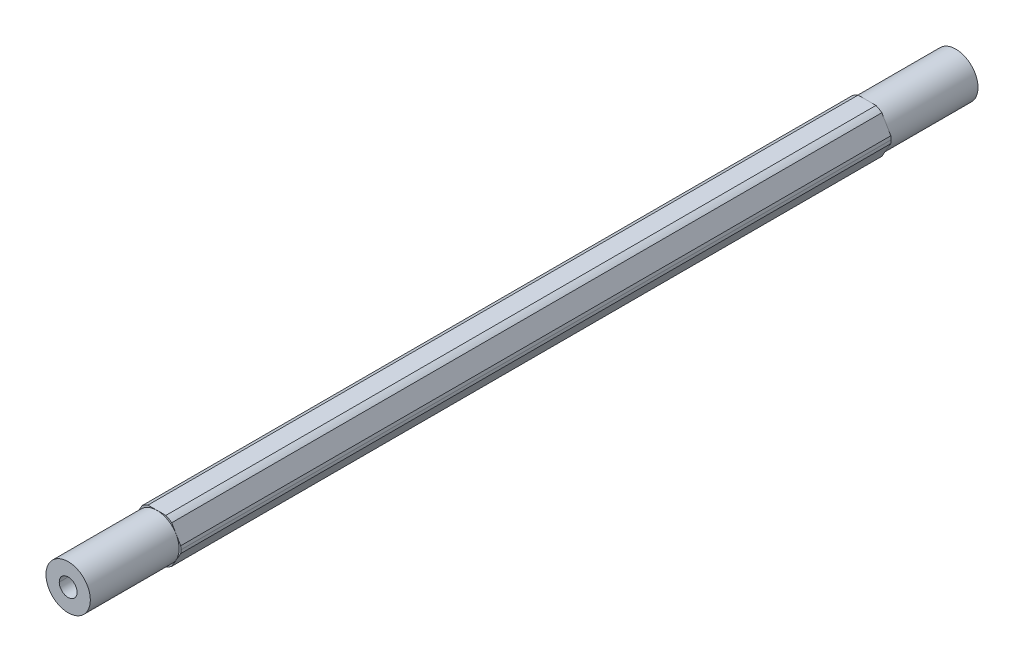
ISO-10303-21;
HEADER;
FILE_DESCRIPTION(('STEP AP214'),'2;1');
FILE_NAME('part.step','',(''),(''),'','','');
FILE_SCHEMA(('AUTOMOTIVE_DESIGN { 1 0 10303 214 1 1 1 1 }'));
ENDSEC;
DATA;
#1=APPLICATION_CONTEXT('core data for automotive mechanical design processes');
#2=APPLICATION_PROTOCOL_DEFINITION('international standard','automotive_design',2000,#1);
#3=PRODUCT_CONTEXT('',#1,'mechanical');
#4=PRODUCT('Part','Part','',(#3));
#5=PRODUCT_RELATED_PRODUCT_CATEGORY('part','',(#4));
#6=PRODUCT_DEFINITION_FORMATION('','',#4);
#7=PRODUCT_DEFINITION_CONTEXT('part definition',#1,'design');
#8=PRODUCT_DEFINITION('design','',#6,#7);
#9=PRODUCT_DEFINITION_SHAPE('','',#8);
#10=(LENGTH_UNIT() NAMED_UNIT(*) SI_UNIT(.MILLI.,.METRE.));
#11=(NAMED_UNIT(*) PLANE_ANGLE_UNIT() SI_UNIT($,.RADIAN.));
#12=(NAMED_UNIT(*) SI_UNIT($,.STERADIAN.) SOLID_ANGLE_UNIT());
#13=UNCERTAINTY_MEASURE_WITH_UNIT(LENGTH_MEASURE(1.E-05),#10,'distance_accuracy_value','');
#14=(GEOMETRIC_REPRESENTATION_CONTEXT(3) GLOBAL_UNCERTAINTY_ASSIGNED_CONTEXT((#13)) GLOBAL_UNIT_ASSIGNED_CONTEXT((#10,
#11,#12)) REPRESENTATION_CONTEXT('',''));
#15=CARTESIAN_POINT('',(0.,0.,0.));
#16=DIRECTION('',(0.,0.,1.));
#17=DIRECTION('',(1.,0.,0.));
#18=AXIS2_PLACEMENT_3D('',#15,#16,#17);
#19=CARTESIAN_POINT('',(0.,0.,-228.6));
#20=DIRECTION('',(0.,0.,1.));
#21=DIRECTION('',(1.,0.,0.));
#22=AXIS2_PLACEMENT_3D('',#19,#20,#21);
#23=CYLINDRICAL_SURFACE('',#22,6.87);
#24=DIRECTION('',(0.,0.,1.));
#25=VECTOR('',#24,1.);
#26=CARTESIAN_POINT('',(6.87,0.,-228.6));
#27=LINE('',#26,#25);
#28=CARTESIAN_POINT('',(6.87,0.,0.));
#29=VERTEX_POINT('',#28);
#30=CARTESIAN_POINT('',(6.87,0.,203.2));
#31=VERTEX_POINT('',#30);
#32=EDGE_CURVE('E165',#29,#31,#27,.T.);
#33=ORIENTED_EDGE('',*,*,#32,.T.);
#34=CARTESIAN_POINT('',(0.,0.,203.2));
#35=DIRECTION('',(0.,0.,1.));
#36=DIRECTION('',(1.,0.,0.));
#37=AXIS2_PLACEMENT_3D('',#34,#35,#36);
#38=CIRCLE('',#37,6.87);
#39=CARTESIAN_POINT('',(6.80102150534208,-0.971085209378942,203.2));
#40=VERTEX_POINT('',#39);
#41=EDGE_CURVE('E148',#40,#31,#38,.T.);
#42=ORIENTED_EDGE('',*,*,#41,.F.);
#43=DIRECTION('',(0.,0.,-1.));
#44=VECTOR('',#43,1.);
#45=CARTESIAN_POINT('',(6.80102150534208,-0.971085209378962,-228.6));
#46=LINE('',#45,#44);
#47=CARTESIAN_POINT('',(6.80102150534208,-0.971085209378955,0.));
#48=VERTEX_POINT('',#47);
#49=EDGE_CURVE('E174',#40,#48,#46,.T.);
#50=ORIENTED_EDGE('',*,*,#49,.T.);
#51=CARTESIAN_POINT('',(0.,0.,0.));
#52=DIRECTION('',(0.,0.,1.));
#53=DIRECTION('',(1.,0.,0.));
#54=AXIS2_PLACEMENT_3D('',#51,#52,#53);
#55=CIRCLE('',#54,6.87);
#56=EDGE_CURVE('E172',#48,#29,#55,.T.);
#57=ORIENTED_EDGE('',*,*,#56,.T.);
#58=EDGE_LOOP('',(#33,#42,#50,#57));
#59=FACE_BOUND('',#58,.T.);
#60=ADVANCED_FACE('F40',(#59),#23,.T.);
#61=CARTESIAN_POINT('',(3.68083890619154,-6.3754,228.6));
#62=DIRECTION('',(-0.866025403784439,0.5,0.));
#63=DIRECTION('',(0.,0.,1.));
#64=AXIS2_PLACEMENT_3D('',#61,#62,#63);
#65=PLANE('',#64);
#66=DIRECTION('',(0.5,0.866025403784439,0.));
#67=VECTOR('',#66,1.);
#68=CARTESIAN_POINT('',(3.68083890619154,-6.3754,203.2));
#69=LINE('',#68,#67);
#70=CARTESIAN_POINT('',(4.24149521323255,-5.40431479062105,203.2));
#71=VERTEX_POINT('',#70);
#72=EDGE_CURVE('E153',#71,#40,#69,.T.);
#73=ORIENTED_EDGE('',*,*,#72,.F.);
#74=DIRECTION('',(0.,0.,1.));
#75=VECTOR('',#74,1.);
#76=CARTESIAN_POINT('',(4.24149521323255,-5.40431479062104,-228.6));
#77=LINE('',#76,#75);
#78=CARTESIAN_POINT('',(4.24149521323255,-5.40431479062105,0.));
#79=VERTEX_POINT('',#78);
#80=EDGE_CURVE('E206',#79,#71,#77,.T.);
#81=ORIENTED_EDGE('',*,*,#80,.F.);
#82=DIRECTION('',(0.5,0.866025403784439,0.));
#83=VECTOR('',#82,1.);
#84=CARTESIAN_POINT('',(3.68083890619154,-6.3754,0.));
#85=LINE('',#84,#83);
#86=EDGE_CURVE('E262',#79,#48,#85,.T.);
#87=ORIENTED_EDGE('',*,*,#86,.T.);
#88=ORIENTED_EDGE('',*,*,#49,.F.);
#89=EDGE_LOOP('',(#73,#81,#87,#88));
#90=FACE_BOUND('',#89,.T.);
#91=ADVANCED_FACE('F298',(#90),#65,.F.);
#92=CARTESIAN_POINT('',(7.36167781238308,0.,228.6));
#93=DIRECTION('',(-0.866025403784439,-0.5,0.));
#94=DIRECTION('',(-0.5,0.866025403784439,0.));
#95=AXIS2_PLACEMENT_3D('',#92,#93,#94);
#96=PLANE('',#95);
#97=DIRECTION('',(-0.5,0.866025403784439,0.));
#98=VECTOR('',#97,1.);
#99=CARTESIAN_POINT('',(7.36167781238308,0.,203.2));
#100=LINE('',#99,#98);
#101=CARTESIAN_POINT('',(6.80102150534208,0.97108520937895,203.2));
#102=VERTEX_POINT('',#101);
#103=CARTESIAN_POINT('',(4.24149521323254,5.40431479062105,203.2));
#104=VERTEX_POINT('',#103);
#105=EDGE_CURVE('E55',#102,#104,#100,.T.);
#106=ORIENTED_EDGE('',*,*,#105,.F.);
#107=DIRECTION('',(0.,0.,1.));
#108=VECTOR('',#107,1.);
#109=CARTESIAN_POINT('',(6.80102150534208,0.971085209378949,-228.6));
#110=LINE('',#109,#108);
#111=CARTESIAN_POINT('',(6.80102150534208,0.971085209378949,0.));
#112=VERTEX_POINT('',#111);
#113=EDGE_CURVE('E167',#112,#102,#110,.T.);
#114=ORIENTED_EDGE('',*,*,#113,.F.);
#115=DIRECTION('',(-0.5,0.866025403784439,0.));
#116=VECTOR('',#115,1.);
#117=CARTESIAN_POINT('',(7.36167781238308,0.,0.));
#118=LINE('',#117,#116);
#119=CARTESIAN_POINT('',(4.24149521323254,5.40431479062105,0.));
#120=VERTEX_POINT('',#119);
#121=EDGE_CURVE('E259',#112,#120,#118,.T.);
#122=ORIENTED_EDGE('',*,*,#121,.T.);
#123=DIRECTION('',(0.,0.,-1.));
#124=VECTOR('',#123,1.);
#125=CARTESIAN_POINT('',(4.24149521323254,5.40431479062105,-228.6));
#126=LINE('',#125,#124);
#127=EDGE_CURVE('E268',#104,#120,#126,.T.);
#128=ORIENTED_EDGE('',*,*,#127,.F.);
#129=EDGE_LOOP('',(#106,#114,#122,#128));
#130=FACE_BOUND('',#129,.T.);
#131=ADVANCED_FACE('F340',(#130),#96,.F.);
#132=CARTESIAN_POINT('',(3.68083890619154,6.3754,228.6));
#133=DIRECTION('',(0.,-1.,0.));
#134=DIRECTION('',(0.,0.,-1.));
#135=AXIS2_PLACEMENT_3D('',#132,#133,#134);
#136=PLANE('',#135);
#137=DIRECTION('',(-1.,0.,0.));
#138=VECTOR('',#137,1.);
#139=CARTESIAN_POINT('',(3.68083890619154,6.3754,203.2));
#140=LINE('',#139,#138);
#141=CARTESIAN_POINT('',(2.55952629210953,6.37540000000001,203.2));
#142=VERTEX_POINT('',#141);
#143=CARTESIAN_POINT('',(-2.55952629210953,6.3754,203.2));
#144=VERTEX_POINT('',#143);
#145=EDGE_CURVE('E236',#142,#144,#140,.T.);
#146=ORIENTED_EDGE('',*,*,#145,.F.);
#147=DIRECTION('',(0.,0.,1.));
#148=VECTOR('',#147,1.);
#149=CARTESIAN_POINT('',(2.55952629210952,6.3754,-228.6));
#150=LINE('',#149,#148);
#151=CARTESIAN_POINT('',(2.55952629210952,6.3754,0.));
#152=VERTEX_POINT('',#151);
#153=EDGE_CURVE('E197',#152,#142,#150,.T.);
#154=ORIENTED_EDGE('',*,*,#153,.F.);
#155=DIRECTION('',(-1.,0.,0.));
#156=VECTOR('',#155,1.);
#157=CARTESIAN_POINT('',(3.68083890619154,6.3754,0.));
#158=LINE('',#157,#156);
#159=CARTESIAN_POINT('',(-2.55952629210953,6.3754,0.));
#160=VERTEX_POINT('',#159);
#161=EDGE_CURVE('E62',#152,#160,#158,.T.);
#162=ORIENTED_EDGE('',*,*,#161,.T.);
#163=DIRECTION('',(0.,0.,-1.));
#164=VECTOR('',#163,1.);
#165=CARTESIAN_POINT('',(-2.55952629210953,6.3754,-228.6));
#166=LINE('',#165,#164);
#167=EDGE_CURVE('E191',#144,#160,#166,.T.);
#168=ORIENTED_EDGE('',*,*,#167,.F.);
#169=EDGE_LOOP('',(#146,#154,#162,#168));
#170=FACE_BOUND('',#169,.T.);
#171=ADVANCED_FACE('F278',(#170),#136,.F.);
#172=CARTESIAN_POINT('',(-3.68083890619154,6.3754,228.6));
#173=DIRECTION('',(0.866025403784439,-0.5,0.));
#174=DIRECTION('',(0.,0.,-1.));
#175=AXIS2_PLACEMENT_3D('',#172,#173,#174);
#176=PLANE('',#175);
#177=DIRECTION('',(-0.5,-0.866025403784439,0.));
#178=VECTOR('',#177,1.);
#179=CARTESIAN_POINT('',(-3.68083890619154,6.3754,203.2));
#180=LINE('',#179,#178);
#181=CARTESIAN_POINT('',(-4.24149521323255,5.40431479062105,203.2));
#182=VERTEX_POINT('',#181);
#183=CARTESIAN_POINT('',(-6.80102150534208,0.97108520937896,203.2));
#184=VERTEX_POINT('',#183);
#185=EDGE_CURVE('E234',#182,#184,#180,.T.);
#186=ORIENTED_EDGE('',*,*,#185,.F.);
#187=DIRECTION('',(0.,0.,1.));
#188=VECTOR('',#187,1.);
#189=CARTESIAN_POINT('',(-4.24149521323255,5.40431479062105,-228.6));
#190=LINE('',#189,#188);
#191=CARTESIAN_POINT('',(-4.24149521323255,5.40431479062105,0.));
#192=VERTEX_POINT('',#191);
#193=EDGE_CURVE('E183',#192,#182,#190,.T.);
#194=ORIENTED_EDGE('',*,*,#193,.F.);
#195=DIRECTION('',(-0.5,-0.866025403784439,0.));
#196=VECTOR('',#195,1.);
#197=CARTESIAN_POINT('',(-3.68083890619154,6.3754,0.));
#198=LINE('',#197,#196);
#199=CARTESIAN_POINT('',(-6.80102150534208,0.97108520937896,0.));
#200=VERTEX_POINT('',#199);
#201=EDGE_CURVE('E255',#192,#200,#198,.T.);
#202=ORIENTED_EDGE('',*,*,#201,.T.);
#203=DIRECTION('',(0.,0.,-1.));
#204=VECTOR('',#203,1.);
#205=CARTESIAN_POINT('',(-6.80102150534208,0.97108520937896,-228.6));
#206=LINE('',#205,#204);
#207=EDGE_CURVE('E185',#184,#200,#206,.T.);
#208=ORIENTED_EDGE('',*,*,#207,.F.);
#209=EDGE_LOOP('',(#186,#194,#202,#208));
#210=FACE_BOUND('',#209,.T.);
#211=ADVANCED_FACE('F315',(#210),#176,.F.);
#212=CARTESIAN_POINT('',(-7.36167781238308,0.,228.6));
#213=DIRECTION('',(0.866025403784439,0.5,0.));
#214=DIRECTION('',(0.,0.,-1.));
#215=AXIS2_PLACEMENT_3D('',#212,#213,#214);
#216=PLANE('',#215);
#217=DIRECTION('',(0.5,-0.866025403784439,0.));
#218=VECTOR('',#217,1.);
#219=CARTESIAN_POINT('',(-7.36167781238308,0.,203.2));
#220=LINE('',#219,#218);
#221=CARTESIAN_POINT('',(-6.80102150534208,-0.971085209378959,203.2));
#222=VERTEX_POINT('',#221);
#223=CARTESIAN_POINT('',(-4.24149521323255,-5.40431479062105,203.2));
#224=VERTEX_POINT('',#223);
#225=EDGE_CURVE('E232',#222,#224,#220,.T.);
#226=ORIENTED_EDGE('',*,*,#225,.F.);
#227=DIRECTION('',(0.,0.,1.));
#228=VECTOR('',#227,1.);
#229=CARTESIAN_POINT('',(-6.80102150534208,-0.971085209378962,-228.6));
#230=LINE('',#229,#228);
#231=CARTESIAN_POINT('',(-6.80102150534208,-0.971085209378959,0.));
#232=VERTEX_POINT('',#231);
#233=EDGE_CURVE('E188',#232,#222,#230,.T.);
#234=ORIENTED_EDGE('',*,*,#233,.F.);
#235=DIRECTION('',(0.5,-0.866025403784439,0.));
#236=VECTOR('',#235,1.);
#237=CARTESIAN_POINT('',(-7.36167781238308,0.,0.));
#238=LINE('',#237,#236);
#239=CARTESIAN_POINT('',(-4.24149521323255,-5.40431479062105,0.));
#240=VERTEX_POINT('',#239);
#241=EDGE_CURVE('E252',#232,#240,#238,.T.);
#242=ORIENTED_EDGE('',*,*,#241,.T.);
#243=DIRECTION('',(0.,0.,-1.));
#244=VECTOR('',#243,1.);
#245=CARTESIAN_POINT('',(-4.24149521323255,-5.40431479062104,-228.6));
#246=LINE('',#245,#244);
#247=EDGE_CURVE('E194',#224,#240,#246,.T.);
#248=ORIENTED_EDGE('',*,*,#247,.F.);
#249=EDGE_LOOP('',(#226,#234,#242,#248));
#250=FACE_BOUND('',#249,.T.);
#251=ADVANCED_FACE('F319',(#250),#216,.F.);
#252=CARTESIAN_POINT('',(-3.68083890619154,-6.3754,228.6));
#253=DIRECTION('',(0.,1.,0.));
#254=DIRECTION('',(1.,0.,0.));
#255=AXIS2_PLACEMENT_3D('',#252,#253,#254);
#256=PLANE('',#255);
#257=DIRECTION('',(1.,0.,0.));
#258=VECTOR('',#257,1.);
#259=CARTESIAN_POINT('',(-3.68083890619154,-6.3754,203.2));
#260=LINE('',#259,#258);
#261=CARTESIAN_POINT('',(-2.55952629210953,-6.3754,203.2));
#262=VERTEX_POINT('',#261);
#263=CARTESIAN_POINT('',(2.55952629210953,-6.3754,203.2));
#264=VERTEX_POINT('',#263);
#265=EDGE_CURVE('E168',#262,#264,#260,.T.);
#266=ORIENTED_EDGE('',*,*,#265,.F.);
#267=DIRECTION('',(0.,0.,1.));
#268=VECTOR('',#267,1.);
#269=CARTESIAN_POINT('',(-2.55952629210953,-6.3754,-228.6));
#270=LINE('',#269,#268);
#271=CARTESIAN_POINT('',(-2.55952629210953,-6.3754,0.));
#272=VERTEX_POINT('',#271);
#273=EDGE_CURVE('E187',#272,#262,#270,.T.);
#274=ORIENTED_EDGE('',*,*,#273,.F.);
#275=DIRECTION('',(1.,0.,0.));
#276=VECTOR('',#275,1.);
#277=CARTESIAN_POINT('',(-3.68083890619154,-6.3754,0.));
#278=LINE('',#277,#276);
#279=CARTESIAN_POINT('',(2.55952629210953,-6.3754,0.));
#280=VERTEX_POINT('',#279);
#281=EDGE_CURVE('E248',#272,#280,#278,.T.);
#282=ORIENTED_EDGE('',*,*,#281,.T.);
#283=DIRECTION('',(0.,0.,-1.));
#284=VECTOR('',#283,1.);
#285=CARTESIAN_POINT('',(2.55952629210953,-6.3754,-228.6));
#286=LINE('',#285,#284);
#287=EDGE_CURVE('E204',#264,#280,#286,.T.);
#288=ORIENTED_EDGE('',*,*,#287,.F.);
#289=EDGE_LOOP('',(#266,#274,#282,#288));
#290=FACE_BOUND('',#289,.T.);
#291=ADVANCED_FACE('F221',(#290),#256,.F.);
#292=CARTESIAN_POINT('',(0.,0.,228.6));
#293=DIRECTION('',(0.,0.,1.));
#294=DIRECTION('',(1.,0.,0.));
#295=AXIS2_PLACEMENT_3D('',#292,#293,#294);
#296=PLANE('',#295);
#297=CARTESIAN_POINT('',(0.,0.,228.6));
#298=DIRECTION('',(0.,0.,1.));
#299=DIRECTION('',(1.,0.,0.));
#300=AXIS2_PLACEMENT_3D('',#297,#298,#299);
#301=CIRCLE('',#300,2.55);
#302=CARTESIAN_POINT('',(2.55,0.,228.6));
#303=VERTEX_POINT('',#302);
#304=CARTESIAN_POINT('',(-2.55,0.,228.6));
#305=VERTEX_POINT('',#304);
#306=EDGE_CURVE('E198',#303,#305,#301,.T.);
#307=ORIENTED_EDGE('',*,*,#306,.F.);
#308=CARTESIAN_POINT('',(0.,0.,228.6));
#309=DIRECTION('',(0.,0.,1.));
#310=DIRECTION('',(1.,0.,0.));
#311=AXIS2_PLACEMENT_3D('',#308,#309,#310);
#312=CIRCLE('',#311,2.55);
#313=EDGE_CURVE('E173',#305,#303,#312,.T.);
#314=ORIENTED_EDGE('',*,*,#313,.F.);
#315=EDGE_LOOP('',(#307,#314));
#316=FACE_BOUND('',#315,.T.);
#317=CARTESIAN_POINT('',(0.,0.,228.6));
#318=DIRECTION('',(0.,0.,1.));
#319=DIRECTION('',(1.,0.,0.));
#320=AXIS2_PLACEMENT_3D('',#317,#318,#319);
#321=CIRCLE('',#320,6.35);
#322=CARTESIAN_POINT('',(6.35,0.,228.6));
#323=VERTEX_POINT('',#322);
#324=EDGE_CURVE('E225',#323,#323,#321,.T.);
#325=ORIENTED_EDGE('',*,*,#324,.T.);
#326=EDGE_LOOP('',(#325));
#327=FACE_BOUND('',#326,.T.);
#328=ADVANCED_FACE('F218',(#316,#327),#296,.T.);
#329=CARTESIAN_POINT('',(0.,0.,-228.6));
#330=DIRECTION('',(0.,0.,1.));
#331=DIRECTION('',(1.,0.,0.));
#332=AXIS2_PLACEMENT_3D('',#329,#330,#331);
#333=CYLINDRICAL_SURFACE('',#332,6.87);
#334=ORIENTED_EDGE('',*,*,#113,.T.);
#335=EDGE_CURVE('E151',#31,#102,#38,.T.);
#336=ORIENTED_EDGE('',*,*,#335,.F.);
#337=ORIENTED_EDGE('',*,*,#32,.F.);
#338=EDGE_CURVE('E246',#29,#112,#55,.T.);
#339=ORIENTED_EDGE('',*,*,#338,.T.);
#340=EDGE_LOOP('',(#334,#336,#337,#339));
#341=FACE_BOUND('',#340,.T.);
#342=ADVANCED_FACE('F163',(#341),#333,.T.);
#343=CARTESIAN_POINT('',(0.,0.,-228.6));
#344=DIRECTION('',(0.,0.,1.));
#345=DIRECTION('',(1.,0.,0.));
#346=AXIS2_PLACEMENT_3D('',#343,#344,#345);
#347=CYLINDRICAL_SURFACE('',#346,6.87);
#348=ORIENTED_EDGE('',*,*,#80,.T.);
#349=EDGE_CURVE('E157',#264,#71,#38,.T.);
#350=ORIENTED_EDGE('',*,*,#349,.F.);
#351=ORIENTED_EDGE('',*,*,#287,.T.);
#352=EDGE_CURVE('E302',#280,#79,#55,.T.);
#353=ORIENTED_EDGE('',*,*,#352,.T.);
#354=EDGE_LOOP('',(#348,#350,#351,#353));
#355=FACE_BOUND('',#354,.T.);
#356=ADVANCED_FACE('F300',(#355),#347,.T.);
#357=CARTESIAN_POINT('',(0.,0.,-228.6));
#358=DIRECTION('',(0.,0.,1.));
#359=DIRECTION('',(1.,0.,0.));
#360=AXIS2_PLACEMENT_3D('',#357,#358,#359);
#361=CYLINDRICAL_SURFACE('',#360,6.87);
#362=ORIENTED_EDGE('',*,*,#273,.T.);
#363=EDGE_CURVE('E288',#224,#262,#38,.T.);
#364=ORIENTED_EDGE('',*,*,#363,.F.);
#365=ORIENTED_EDGE('',*,*,#247,.T.);
#366=EDGE_CURVE('E303',#240,#272,#55,.T.);
#367=ORIENTED_EDGE('',*,*,#366,.T.);
#368=EDGE_LOOP('',(#362,#364,#365,#367));
#369=FACE_BOUND('',#368,.T.);
#370=ADVANCED_FACE('F321',(#369),#361,.T.);
#371=CARTESIAN_POINT('',(0.,0.,-228.6));
#372=DIRECTION('',(0.,0.,1.));
#373=DIRECTION('',(1.,0.,0.));
#374=AXIS2_PLACEMENT_3D('',#371,#372,#373);
#375=CYLINDRICAL_SURFACE('',#374,6.87);
#376=ORIENTED_EDGE('',*,*,#233,.T.);
#377=EDGE_CURVE('E287',#184,#222,#38,.T.);
#378=ORIENTED_EDGE('',*,*,#377,.F.);
#379=ORIENTED_EDGE('',*,*,#207,.T.);
#380=EDGE_CURVE('E305',#200,#232,#55,.T.);
#381=ORIENTED_EDGE('',*,*,#380,.T.);
#382=EDGE_LOOP('',(#376,#378,#379,#381));
#383=FACE_BOUND('',#382,.T.);
#384=ADVANCED_FACE('F317',(#383),#375,.T.);
#385=CARTESIAN_POINT('',(0.,0.,-228.6));
#386=DIRECTION('',(0.,0.,1.));
#387=DIRECTION('',(1.,0.,0.));
#388=AXIS2_PLACEMENT_3D('',#385,#386,#387);
#389=CYLINDRICAL_SURFACE('',#388,6.87);
#390=ORIENTED_EDGE('',*,*,#193,.T.);
#391=EDGE_CURVE('E169',#144,#182,#38,.T.);
#392=ORIENTED_EDGE('',*,*,#391,.F.);
#393=ORIENTED_EDGE('',*,*,#167,.T.);
#394=EDGE_CURVE('E310',#160,#192,#55,.T.);
#395=ORIENTED_EDGE('',*,*,#394,.T.);
#396=EDGE_LOOP('',(#390,#392,#393,#395));
#397=FACE_BOUND('',#396,.T.);
#398=ADVANCED_FACE('F284',(#397),#389,.T.);
#399=CARTESIAN_POINT('',(0.,0.,-228.6));
#400=DIRECTION('',(0.,0.,1.));
#401=DIRECTION('',(1.,0.,0.));
#402=AXIS2_PLACEMENT_3D('',#399,#400,#401);
#403=CYLINDRICAL_SURFACE('',#402,6.87);
#404=ORIENTED_EDGE('',*,*,#153,.T.);
#405=CARTESIAN_POINT('',(0.,0.,203.2));
#406=DIRECTION('',(0.,0.,1.));
#407=DIRECTION('',(1.,0.,0.));
#408=AXIS2_PLACEMENT_3D('',#405,#406,#407);
#409=CIRCLE('',#408,6.87);
#410=EDGE_CURVE('E11',#142,#104,#409,.F.);
#411=ORIENTED_EDGE('',*,*,#410,.T.);
#412=ORIENTED_EDGE('',*,*,#127,.T.);
#413=EDGE_CURVE('E249',#120,#152,#55,.T.);
#414=ORIENTED_EDGE('',*,*,#413,.T.);
#415=EDGE_LOOP('',(#404,#411,#412,#414));
#416=FACE_BOUND('',#415,.T.);
#417=ADVANCED_FACE('F274',(#416),#403,.T.);
#418=CARTESIAN_POINT('',(0.,0.,-25.4));
#419=DIRECTION('',(0.,0.,1.));
#420=DIRECTION('',(1.,0.,0.));
#421=AXIS2_PLACEMENT_3D('',#418,#419,#420);
#422=PLANE('',#421);
#423=CARTESIAN_POINT('',(0.,0.,-25.4));
#424=DIRECTION('',(0.,0.,1.));
#425=DIRECTION('',(1.,0.,0.));
#426=AXIS2_PLACEMENT_3D('',#423,#424,#425);
#427=CIRCLE('',#426,2.55);
#428=CARTESIAN_POINT('',(-2.55,0.,-25.4));
#429=VERTEX_POINT('',#428);
#430=CARTESIAN_POINT('',(2.55,0.,-25.4));
#431=VERTEX_POINT('',#430);
#432=EDGE_CURVE('E48',#429,#431,#427,.F.);
#433=ORIENTED_EDGE('',*,*,#432,.F.);
#434=CARTESIAN_POINT('',(0.,0.,-25.4));
#435=DIRECTION('',(0.,0.,1.));
#436=DIRECTION('',(1.,0.,0.));
#437=AXIS2_PLACEMENT_3D('',#434,#435,#436);
#438=CIRCLE('',#437,2.55);
#439=EDGE_CURVE('E203',#431,#429,#438,.F.);
#440=ORIENTED_EDGE('',*,*,#439,.F.);
#441=EDGE_LOOP('',(#433,#440));
#442=FACE_BOUND('',#441,.T.);
#443=CARTESIAN_POINT('',(0.,0.,-25.4));
#444=DIRECTION('',(0.,0.,1.));
#445=DIRECTION('',(1.,0.,0.));
#446=AXIS2_PLACEMENT_3D('',#443,#444,#445);
#447=CIRCLE('',#446,6.35);
#448=CARTESIAN_POINT('',(6.35,0.,-25.4));
#449=VERTEX_POINT('',#448);
#450=EDGE_CURVE('E240',#449,#449,#447,.T.);
#451=ORIENTED_EDGE('',*,*,#450,.F.);
#452=EDGE_LOOP('',(#451));
#453=FACE_BOUND('',#452,.T.);
#454=ADVANCED_FACE('F353',(#442,#453),#422,.F.);
#455=CARTESIAN_POINT('',(0.,0.,-228.6));
#456=DIRECTION('',(0.,0.,1.));
#457=DIRECTION('',(1.,0.,0.));
#458=AXIS2_PLACEMENT_3D('',#455,#456,#457);
#459=CYLINDRICAL_SURFACE('',#458,2.55);
#460=DIRECTION('',(0.,0.,1.));
#461=VECTOR('',#460,1.);
#462=CARTESIAN_POINT('',(2.55,0.,-228.6));
#463=LINE('',#462,#461);
#464=EDGE_CURVE('E195',#431,#303,#463,.T.);
#465=ORIENTED_EDGE('',*,*,#464,.F.);
#466=ORIENTED_EDGE('',*,*,#439,.T.);
#467=DIRECTION('',(0.,0.,1.));
#468=VECTOR('',#467,1.);
#469=CARTESIAN_POINT('',(-2.55,0.,-228.6));
#470=LINE('',#469,#468);
#471=EDGE_CURVE('E178',#429,#305,#470,.T.);
#472=ORIENTED_EDGE('',*,*,#471,.T.);
#473=ORIENTED_EDGE('',*,*,#313,.T.);
#474=EDGE_LOOP('',(#465,#466,#472,#473));
#475=FACE_BOUND('',#474,.T.);
#476=ADVANCED_FACE('F214',(#475),#459,.F.);
#477=CARTESIAN_POINT('',(0.,0.,-228.6));
#478=DIRECTION('',(0.,0.,1.));
#479=DIRECTION('',(1.,0.,0.));
#480=AXIS2_PLACEMENT_3D('',#477,#478,#479);
#481=CYLINDRICAL_SURFACE('',#480,2.55);
#482=ORIENTED_EDGE('',*,*,#471,.F.);
#483=ORIENTED_EDGE('',*,*,#432,.T.);
#484=ORIENTED_EDGE('',*,*,#464,.T.);
#485=ORIENTED_EDGE('',*,*,#306,.T.);
#486=EDGE_LOOP('',(#482,#483,#484,#485));
#487=FACE_BOUND('',#486,.T.);
#488=ADVANCED_FACE('F42',(#487),#481,.F.);
#489=CARTESIAN_POINT('',(0.,0.,0.));
#490=DIRECTION('',(0.,0.,1.));
#491=DIRECTION('',(1.,0.,0.));
#492=AXIS2_PLACEMENT_3D('',#489,#490,#491);
#493=PLANE('',#492);
#494=CARTESIAN_POINT('',(0.,0.,0.));
#495=DIRECTION('',(0.,0.,1.));
#496=DIRECTION('',(1.,0.,0.));
#497=AXIS2_PLACEMENT_3D('',#494,#495,#496);
#498=CIRCLE('',#497,6.35);
#499=CARTESIAN_POINT('',(6.35,0.,0.));
#500=VERTEX_POINT('',#499);
#501=EDGE_CURVE('E241',#500,#500,#498,.T.);
#502=ORIENTED_EDGE('',*,*,#501,.T.);
#503=EDGE_LOOP('',(#502));
#504=FACE_BOUND('',#503,.T.);
#505=ORIENTED_EDGE('',*,*,#352,.F.);
#506=ORIENTED_EDGE('',*,*,#281,.F.);
#507=ORIENTED_EDGE('',*,*,#366,.F.);
#508=ORIENTED_EDGE('',*,*,#241,.F.);
#509=ORIENTED_EDGE('',*,*,#380,.F.);
#510=ORIENTED_EDGE('',*,*,#201,.F.);
#511=ORIENTED_EDGE('',*,*,#394,.F.);
#512=ORIENTED_EDGE('',*,*,#161,.F.);
#513=ORIENTED_EDGE('',*,*,#413,.F.);
#514=ORIENTED_EDGE('',*,*,#121,.F.);
#515=ORIENTED_EDGE('',*,*,#338,.F.);
#516=ORIENTED_EDGE('',*,*,#56,.F.);
#517=ORIENTED_EDGE('',*,*,#86,.F.);
#518=EDGE_LOOP('',(#505,#506,#507,#508,#509,#510,#511,#512,#513,#514,#515,#516,#517));
#519=FACE_BOUND('',#518,.T.);
#520=ADVANCED_FACE('F323',(#504,#519),#493,.F.);
#521=CARTESIAN_POINT('',(0.,0.,0.));
#522=DIRECTION('',(0.,0.,-1.));
#523=DIRECTION('',(-1.,0.,0.));
#524=AXIS2_PLACEMENT_3D('',#521,#522,#523);
#525=CYLINDRICAL_SURFACE('',#524,6.35);
#526=ORIENTED_EDGE('',*,*,#501,.F.);
#527=EDGE_LOOP('',(#526));
#528=FACE_BOUND('',#527,.T.);
#529=ORIENTED_EDGE('',*,*,#450,.T.);
#530=EDGE_LOOP('',(#529));
#531=FACE_BOUND('',#530,.T.);
#532=ADVANCED_FACE('F325',(#528,#531),#525,.T.);
#533=CARTESIAN_POINT('',(0.,0.,203.2));
#534=DIRECTION('',(0.,0.,1.));
#535=DIRECTION('',(1.,0.,0.));
#536=AXIS2_PLACEMENT_3D('',#533,#534,#535);
#537=PLANE('',#536);
#538=CARTESIAN_POINT('',(0.,0.,203.2));
#539=DIRECTION('',(0.,0.,1.));
#540=DIRECTION('',(1.,0.,0.));
#541=AXIS2_PLACEMENT_3D('',#538,#539,#540);
#542=CIRCLE('',#541,6.35);
#543=CARTESIAN_POINT('',(6.35,0.,203.2));
#544=VERTEX_POINT('',#543);
#545=EDGE_CURVE('E158',#544,#544,#542,.T.);
#546=ORIENTED_EDGE('',*,*,#545,.F.);
#547=EDGE_LOOP('',(#546));
#548=FACE_BOUND('',#547,.T.);
#549=ORIENTED_EDGE('',*,*,#72,.T.);
#550=ORIENTED_EDGE('',*,*,#41,.T.);
#551=ORIENTED_EDGE('',*,*,#335,.T.);
#552=ORIENTED_EDGE('',*,*,#105,.T.);
#553=ORIENTED_EDGE('',*,*,#410,.F.);
#554=ORIENTED_EDGE('',*,*,#145,.T.);
#555=ORIENTED_EDGE('',*,*,#391,.T.);
#556=ORIENTED_EDGE('',*,*,#185,.T.);
#557=ORIENTED_EDGE('',*,*,#377,.T.);
#558=ORIENTED_EDGE('',*,*,#225,.T.);
#559=ORIENTED_EDGE('',*,*,#363,.T.);
#560=ORIENTED_EDGE('',*,*,#265,.T.);
#561=ORIENTED_EDGE('',*,*,#349,.T.);
#562=EDGE_LOOP('',(#549,#550,#551,#552,#553,#554,#555,#556,#557,#558,#559,#560,#561));
#563=FACE_BOUND('',#562,.T.);
#564=ADVANCED_FACE('F150',(#548,#563),#537,.T.);
#565=CARTESIAN_POINT('',(0.,0.,203.2));
#566=DIRECTION('',(0.,0.,1.));
#567=DIRECTION('',(1.,0.,0.));
#568=AXIS2_PLACEMENT_3D('',#565,#566,#567);
#569=CYLINDRICAL_SURFACE('',#568,6.35);
#570=ORIENTED_EDGE('',*,*,#545,.T.);
#571=EDGE_LOOP('',(#570));
#572=FACE_BOUND('',#571,.T.);
#573=ORIENTED_EDGE('',*,*,#324,.F.);
#574=EDGE_LOOP('',(#573));
#575=FACE_BOUND('',#574,.T.);
#576=ADVANCED_FACE('F479',(#572,#575),#569,.T.);
#577=CLOSED_SHELL('',(#60,#91,#131,#171,#211,#251,#291,#328,#342,#356,#370,#384,#398,#417,#454,
#476,#488,#520,#532,#564,#576));
#578=MANIFOLD_SOLID_BREP('B2',#577);
#579=ADVANCED_BREP_SHAPE_REPRESENTATION('',(#18,#578),#14);
#580=SHAPE_DEFINITION_REPRESENTATION(#9,#579);
ENDSEC;
END-ISO-10303-21;
